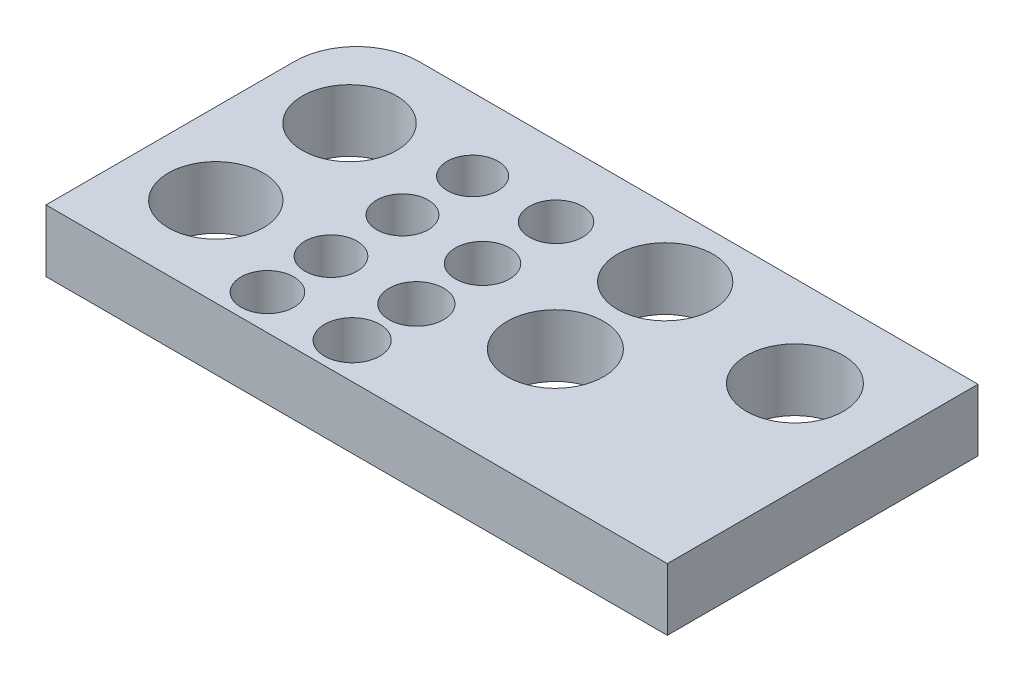
ISO-10303-21;
HEADER;
FILE_DESCRIPTION(('STEP AP214'),'2;1');
FILE_NAME('part.step','',(''),(''),'','','');
FILE_SCHEMA(('AUTOMOTIVE_DESIGN { 1 0 10303 214 1 1 1 1 }'));
ENDSEC;
DATA;
#1=APPLICATION_CONTEXT('core data for automotive mechanical design processes');
#2=APPLICATION_PROTOCOL_DEFINITION('international standard','automotive_design',2000,#1);
#3=PRODUCT_CONTEXT('',#1,'mechanical');
#4=PRODUCT('Part','Part','',(#3));
#5=PRODUCT_RELATED_PRODUCT_CATEGORY('part','',(#4));
#6=PRODUCT_DEFINITION_FORMATION('','',#4);
#7=PRODUCT_DEFINITION_CONTEXT('part definition',#1,'design');
#8=PRODUCT_DEFINITION('design','',#6,#7);
#9=PRODUCT_DEFINITION_SHAPE('','',#8);
#10=(LENGTH_UNIT() NAMED_UNIT(*) SI_UNIT(.MILLI.,.METRE.));
#11=(NAMED_UNIT(*) PLANE_ANGLE_UNIT() SI_UNIT($,.RADIAN.));
#12=(NAMED_UNIT(*) SI_UNIT($,.STERADIAN.) SOLID_ANGLE_UNIT());
#13=UNCERTAINTY_MEASURE_WITH_UNIT(LENGTH_MEASURE(1.E-05),#10,'distance_accuracy_value','');
#14=(GEOMETRIC_REPRESENTATION_CONTEXT(3) GLOBAL_UNCERTAINTY_ASSIGNED_CONTEXT((#13)) GLOBAL_UNIT_ASSIGNED_CONTEXT((#10,
#11,#12)) REPRESENTATION_CONTEXT('',''));
#15=CARTESIAN_POINT('',(0.,0.,0.));
#16=DIRECTION('',(0.,0.,1.));
#17=DIRECTION('',(1.,0.,0.));
#18=AXIS2_PLACEMENT_3D('',#15,#16,#17);
#19=CARTESIAN_POINT('',(50.,10.,25.));
#20=DIRECTION('',(-1.,0.,0.));
#21=DIRECTION('',(0.,0.,1.));
#22=AXIS2_PLACEMENT_3D('',#19,#20,#21);
#23=PLANE('',#22);
#24=DIRECTION('',(0.,0.,-1.));
#25=VECTOR('',#24,1.);
#26=CARTESIAN_POINT('',(50.,0.,25.));
#27=LINE('',#26,#25);
#28=CARTESIAN_POINT('',(50.,0.,25.));
#29=VERTEX_POINT('',#28);
#30=CARTESIAN_POINT('',(50.,0.,-25.));
#31=VERTEX_POINT('',#30);
#32=EDGE_CURVE('E106',#29,#31,#27,.T.);
#33=ORIENTED_EDGE('',*,*,#32,.T.);
#34=DIRECTION('',(0.,-1.,0.));
#35=VECTOR('',#34,1.);
#36=CARTESIAN_POINT('',(50.,10.,-25.));
#37=LINE('',#36,#35);
#38=CARTESIAN_POINT('',(50.,10.,-25.));
#39=VERTEX_POINT('',#38);
#40=EDGE_CURVE('E87',#39,#31,#37,.T.);
#41=ORIENTED_EDGE('',*,*,#40,.F.);
#42=DIRECTION('',(0.,0.,-1.));
#43=VECTOR('',#42,1.);
#44=CARTESIAN_POINT('',(50.,10.,25.));
#45=LINE('',#44,#43);
#46=CARTESIAN_POINT('',(50.,10.,25.));
#47=VERTEX_POINT('',#46);
#48=EDGE_CURVE('E93',#47,#39,#45,.T.);
#49=ORIENTED_EDGE('',*,*,#48,.F.);
#50=DIRECTION('',(0.,-1.,0.));
#51=VECTOR('',#50,1.);
#52=CARTESIAN_POINT('',(50.,10.,25.));
#53=LINE('',#52,#51);
#54=EDGE_CURVE('E116',#47,#29,#53,.T.);
#55=ORIENTED_EDGE('',*,*,#54,.T.);
#56=EDGE_LOOP('',(#33,#41,#49,#55));
#57=FACE_BOUND('',#56,.T.);
#58=ADVANCED_FACE('F39',(#57),#23,.F.);
#59=CARTESIAN_POINT('',(-50.,10.,-25.));
#60=DIRECTION('',(0.,0.,1.));
#61=DIRECTION('',(1.,0.,0.));
#62=AXIS2_PLACEMENT_3D('',#59,#60,#61);
#63=PLANE('',#62);
#64=DIRECTION('',(-1.,0.,0.));
#65=VECTOR('',#64,1.);
#66=CARTESIAN_POINT('',(-50.,0.,-25.));
#67=LINE('',#66,#65);
#68=CARTESIAN_POINT('',(-40.,0.,-25.));
#69=VERTEX_POINT('',#68);
#70=EDGE_CURVE('E129',#31,#69,#67,.T.);
#71=ORIENTED_EDGE('',*,*,#70,.T.);
#72=DIRECTION('',(0.,-1.,0.));
#73=VECTOR('',#72,1.);
#74=CARTESIAN_POINT('',(-40.,10.,-25.));
#75=LINE('',#74,#73);
#76=CARTESIAN_POINT('',(-40.,10.,-25.));
#77=VERTEX_POINT('',#76);
#78=EDGE_CURVE('E48',#69,#77,#75,.F.);
#79=ORIENTED_EDGE('',*,*,#78,.T.);
#80=DIRECTION('',(-1.,0.,0.));
#81=VECTOR('',#80,1.);
#82=CARTESIAN_POINT('',(-50.,10.,-25.));
#83=LINE('',#82,#81);
#84=EDGE_CURVE('E83',#39,#77,#83,.T.);
#85=ORIENTED_EDGE('',*,*,#84,.F.);
#86=ORIENTED_EDGE('',*,*,#40,.T.);
#87=EDGE_LOOP('',(#71,#79,#85,#86));
#88=FACE_BOUND('',#87,.T.);
#89=ADVANCED_FACE('F85',(#88),#63,.F.);
#90=CARTESIAN_POINT('',(-50.,10.,25.));
#91=DIRECTION('',(1.,0.,0.));
#92=DIRECTION('',(0.,0.,-1.));
#93=AXIS2_PLACEMENT_3D('',#90,#91,#92);
#94=PLANE('',#93);
#95=DIRECTION('',(0.,0.,1.));
#96=VECTOR('',#95,1.);
#97=CARTESIAN_POINT('',(-50.,10.,25.));
#98=LINE('',#97,#96);
#99=CARTESIAN_POINT('',(-50.,10.,-15.));
#100=VERTEX_POINT('',#99);
#101=CARTESIAN_POINT('',(-50.,10.,25.));
#102=VERTEX_POINT('',#101);
#103=EDGE_CURVE('E92',#100,#102,#98,.T.);
#104=ORIENTED_EDGE('',*,*,#103,.F.);
#105=DIRECTION('',(0.,-1.,0.));
#106=VECTOR('',#105,1.);
#107=CARTESIAN_POINT('',(-50.,10.,-15.));
#108=LINE('',#107,#106);
#109=CARTESIAN_POINT('',(-50.,0.,-15.));
#110=VERTEX_POINT('',#109);
#111=EDGE_CURVE('E108',#100,#110,#108,.T.);
#112=ORIENTED_EDGE('',*,*,#111,.T.);
#113=DIRECTION('',(0.,0.,1.));
#114=VECTOR('',#113,1.);
#115=CARTESIAN_POINT('',(-50.,0.,25.));
#116=LINE('',#115,#114);
#117=CARTESIAN_POINT('',(-50.,0.,25.));
#118=VERTEX_POINT('',#117);
#119=EDGE_CURVE('E126',#110,#118,#116,.T.);
#120=ORIENTED_EDGE('',*,*,#119,.T.);
#121=DIRECTION('',(0.,-1.,0.));
#122=VECTOR('',#121,1.);
#123=CARTESIAN_POINT('',(-50.,10.,25.));
#124=LINE('',#123,#122);
#125=EDGE_CURVE('E109',#102,#118,#124,.T.);
#126=ORIENTED_EDGE('',*,*,#125,.F.);
#127=EDGE_LOOP('',(#104,#112,#120,#126));
#128=FACE_BOUND('',#127,.T.);
#129=ADVANCED_FACE('F292',(#128),#94,.F.);
#130=CARTESIAN_POINT('',(-50.,10.,25.));
#131=DIRECTION('',(0.,0.,-1.));
#132=DIRECTION('',(-1.,0.,0.));
#133=AXIS2_PLACEMENT_3D('',#130,#131,#132);
#134=PLANE('',#133);
#135=DIRECTION('',(1.,0.,0.));
#136=VECTOR('',#135,1.);
#137=CARTESIAN_POINT('',(-50.,0.,25.));
#138=LINE('',#137,#136);
#139=EDGE_CURVE('E103',#118,#29,#138,.T.);
#140=ORIENTED_EDGE('',*,*,#139,.T.);
#141=ORIENTED_EDGE('',*,*,#54,.F.);
#142=DIRECTION('',(1.,0.,0.));
#143=VECTOR('',#142,1.);
#144=CARTESIAN_POINT('',(-50.,10.,25.));
#145=LINE('',#144,#143);
#146=EDGE_CURVE('E98',#102,#47,#145,.T.);
#147=ORIENTED_EDGE('',*,*,#146,.F.);
#148=ORIENTED_EDGE('',*,*,#125,.T.);
#149=EDGE_LOOP('',(#140,#141,#147,#148));
#150=FACE_BOUND('',#149,.T.);
#151=ADVANCED_FACE('F248',(#150),#134,.F.);
#152=CARTESIAN_POINT('',(0.,10.,0.));
#153=DIRECTION('',(0.,-1.,0.));
#154=DIRECTION('',(0.,0.,-1.));
#155=AXIS2_PLACEMENT_3D('',#152,#153,#154);
#156=PLANE('',#155);
#157=CARTESIAN_POINT('',(35.1513154281321,10.,-10.3856159219481));
#158=DIRECTION('',(0.,1.,0.));
#159=DIRECTION('',(0.,0.,1.));
#160=AXIS2_PLACEMENT_3D('',#157,#158,#159);
#161=CIRCLE('',#160,7.8);
#162=CARTESIAN_POINT('',(35.1513154281321,10.,-2.58561592194814));
#163=VERTEX_POINT('',#162);
#164=EDGE_CURVE('E238',#163,#163,#161,.T.);
#165=ORIENTED_EDGE('',*,*,#164,.F.);
#166=EDGE_LOOP('',(#165));
#167=FACE_BOUND('',#166,.T.);
#168=CARTESIAN_POINT('',(11.0779903167447,10.,4.1009867999487));
#169=DIRECTION('',(0.,1.,0.));
#170=DIRECTION('',(0.,0.,1.));
#171=AXIS2_PLACEMENT_3D('',#168,#169,#170);
#172=CIRCLE('',#171,7.75);
#173=CARTESIAN_POINT('',(11.0779903167447,10.,11.8509867999487));
#174=VERTEX_POINT('',#173);
#175=EDGE_CURVE('E230',#174,#174,#172,.T.);
#176=ORIENTED_EDGE('',*,*,#175,.F.);
#177=EDGE_LOOP('',(#176));
#178=FACE_BOUND('',#177,.T.);
#179=CARTESIAN_POINT('',(10.5453946284396,10.,-14.1137857400834));
#180=DIRECTION('',(0.,1.,0.));
#181=DIRECTION('',(0.,0.,1.));
#182=AXIS2_PLACEMENT_3D('',#179,#180,#181);
#183=CIRCLE('',#182,7.7);
#184=CARTESIAN_POINT('',(10.5453946284396,10.,-6.41378574008336));
#185=VERTEX_POINT('',#184);
#186=EDGE_CURVE('E222',#185,#185,#183,.T.);
#187=ORIENTED_EDGE('',*,*,#186,.F.);
#188=EDGE_LOOP('',(#187));
#189=FACE_BOUND('',#188,.T.);
#190=CARTESIAN_POINT('',(-6.49766739732138,10.,19.2267043478116));
#191=DIRECTION('',(0.,1.,0.));
#192=DIRECTION('',(0.,0.,1.));
#193=AXIS2_PLACEMENT_3D('',#190,#191,#192);
#194=CIRCLE('',#193,4.45);
#195=CARTESIAN_POINT('',(-6.49766739732138,10.,23.6767043478116));
#196=VERTEX_POINT('',#195);
#197=EDGE_CURVE('E214',#196,#196,#194,.T.);
#198=ORIENTED_EDGE('',*,*,#197,.F.);
#199=EDGE_LOOP('',(#198));
#200=FACE_BOUND('',#199,.T.);
#201=CARTESIAN_POINT('',(-6.39114825966038,10.,9.00086713235498));
#202=DIRECTION('',(0.,1.,0.));
#203=DIRECTION('',(0.,0.,1.));
#204=AXIS2_PLACEMENT_3D('',#201,#202,#203);
#205=CIRCLE('',#204,4.4);
#206=CARTESIAN_POINT('',(-6.39114825966038,10.,13.400867132355));
#207=VERTEX_POINT('',#206);
#208=EDGE_CURVE('E206',#207,#207,#205,.T.);
#209=ORIENTED_EDGE('',*,*,#208,.F.);
#210=EDGE_LOOP('',(#209));
#211=FACE_BOUND('',#210,.T.);
#212=CARTESIAN_POINT('',(-6.71070567264338,10.,-1.97060404672865));
#213=DIRECTION('',(0.,1.,0.));
#214=DIRECTION('',(0.,0.,1.));
#215=AXIS2_PLACEMENT_3D('',#212,#213,#214);
#216=CIRCLE('',#215,4.35);
#217=CARTESIAN_POINT('',(-6.71070567264338,10.,2.37939595327135));
#218=VERTEX_POINT('',#217);
#219=EDGE_CURVE('E198',#218,#218,#216,.T.);
#220=ORIENTED_EDGE('',*,*,#219,.F.);
#221=EDGE_LOOP('',(#220));
#222=FACE_BOUND('',#221,.T.);
#223=CARTESIAN_POINT('',(-6.60418653498238,10.,-13.6877091894393));
#224=DIRECTION('',(0.,1.,0.));
#225=DIRECTION('',(0.,0.,1.));
#226=AXIS2_PLACEMENT_3D('',#223,#224,#225);
#227=CIRCLE('',#226,4.3);
#228=CARTESIAN_POINT('',(-6.60418653498238,10.,-9.38770918943933));
#229=VERTEX_POINT('',#228);
#230=EDGE_CURVE('E190',#229,#229,#227,.T.);
#231=ORIENTED_EDGE('',*,*,#230,.F.);
#232=EDGE_LOOP('',(#231));
#233=FACE_BOUND('',#232,.T.);
#234=CARTESIAN_POINT('',(-20.0255978802692,10.,19.3332234854726));
#235=DIRECTION('',(0.,1.,0.));
#236=DIRECTION('',(0.,0.,1.));
#237=AXIS2_PLACEMENT_3D('',#234,#235,#236);
#238=CIRCLE('',#237,4.25);
#239=CARTESIAN_POINT('',(-20.0255978802692,10.,23.5832234854726));
#240=VERTEX_POINT('',#239);
#241=EDGE_CURVE('E182',#240,#240,#238,.T.);
#242=ORIENTED_EDGE('',*,*,#241,.F.);
#243=EDGE_LOOP('',(#242));
#244=FACE_BOUND('',#243,.T.);
#245=CARTESIAN_POINT('',(-19.9190787426082,10.,9.213905407677));
#246=DIRECTION('',(0.,1.,0.));
#247=DIRECTION('',(0.,0.,1.));
#248=AXIS2_PLACEMENT_3D('',#245,#246,#247);
#249=CIRCLE('',#248,4.2);
#250=CARTESIAN_POINT('',(-19.9190787426082,10.,13.413905407677));
#251=VERTEX_POINT('',#250);
#252=EDGE_CURVE('E174',#251,#251,#249,.T.);
#253=ORIENTED_EDGE('',*,*,#252,.F.);
#254=EDGE_LOOP('',(#253));
#255=FACE_BOUND('',#254,.T.);
#256=CARTESIAN_POINT('',(-19.9190787426082,10.,-2.29016145971167));
#257=DIRECTION('',(0.,1.,0.));
#258=DIRECTION('',(0.,0.,1.));
#259=AXIS2_PLACEMENT_3D('',#256,#257,#258);
#260=CIRCLE('',#259,4.15);
#261=CARTESIAN_POINT('',(-19.9190787426082,10.,1.85983854028833));
#262=VERTEX_POINT('',#261);
#263=EDGE_CURVE('E166',#262,#262,#260,.T.);
#264=ORIENTED_EDGE('',*,*,#263,.F.);
#265=EDGE_LOOP('',(#264));
#266=FACE_BOUND('',#265,.T.);
#267=CARTESIAN_POINT('',(-19.7060404672861,10.,-13.3681517764563));
#268=DIRECTION('',(0.,1.,0.));
#269=DIRECTION('',(0.,0.,1.));
#270=AXIS2_PLACEMENT_3D('',#267,#268,#269);
#271=CIRCLE('',#270,4.1);
#272=CARTESIAN_POINT('',(-19.7060404672861,10.,-9.26815177645632));
#273=VERTEX_POINT('',#272);
#274=EDGE_CURVE('E158',#273,#273,#271,.T.);
#275=ORIENTED_EDGE('',*,*,#274,.F.);
#276=EDGE_LOOP('',(#275));
#277=FACE_BOUND('',#276,.T.);
#278=CARTESIAN_POINT('',(-36.9621407683692,10.,10.7051733349311));
#279=DIRECTION('',(0.,1.,0.));
#280=DIRECTION('',(0.,0.,1.));
#281=AXIS2_PLACEMENT_3D('',#278,#279,#280);
#282=CIRCLE('',#281,7.65);
#283=CARTESIAN_POINT('',(-36.9621407683692,10.,18.3551733349311));
#284=VERTEX_POINT('',#283);
#285=EDGE_CURVE('E150',#284,#284,#282,.T.);
#286=ORIENTED_EDGE('',*,*,#285,.F.);
#287=EDGE_LOOP('',(#286));
#288=FACE_BOUND('',#287,.T.);
#289=CARTESIAN_POINT('',(-36.9621407683692,10.,-10.8116924725922));
#290=DIRECTION('',(0.,1.,0.));
#291=DIRECTION('',(0.,0.,1.));
#292=AXIS2_PLACEMENT_3D('',#289,#290,#291);
#293=CIRCLE('',#292,7.59999999999999);
#294=CARTESIAN_POINT('',(-36.9621407683692,10.,-3.21169247259218));
#295=VERTEX_POINT('',#294);
#296=EDGE_CURVE('E142',#295,#295,#293,.T.);
#297=ORIENTED_EDGE('',*,*,#296,.F.);
#298=EDGE_LOOP('',(#297));
#299=FACE_BOUND('',#298,.T.);
#300=ORIENTED_EDGE('',*,*,#84,.T.);
#301=CARTESIAN_POINT('',(-40.,10.,-15.));
#302=DIRECTION('',(0.,-1.,0.));
#303=DIRECTION('',(0.,0.,-1.));
#304=AXIS2_PLACEMENT_3D('',#301,#302,#303);
#305=CIRCLE('',#304,10.);
#306=EDGE_CURVE('E11',#77,#100,#305,.F.);
#307=ORIENTED_EDGE('',*,*,#306,.T.);
#308=ORIENTED_EDGE('',*,*,#103,.T.);
#309=ORIENTED_EDGE('',*,*,#146,.T.);
#310=ORIENTED_EDGE('',*,*,#48,.T.);
#311=EDGE_LOOP('',(#300,#307,#308,#309,#310));
#312=FACE_BOUND('',#311,.T.);
#313=ADVANCED_FACE('F96',(#167,#178,#189,#200,#211,#222,#233,#244,#255,#266,#277,#288,#299,
#312),#156,.F.);
#314=CARTESIAN_POINT('',(0.,0.,0.));
#315=DIRECTION('',(0.,-1.,0.));
#316=DIRECTION('',(0.,0.,-1.));
#317=AXIS2_PLACEMENT_3D('',#314,#315,#316);
#318=PLANE('',#317);
#319=CARTESIAN_POINT('',(35.1513154281321,0.,-10.3856159219481));
#320=DIRECTION('',(0.,1.,0.));
#321=DIRECTION('',(0.,0.,1.));
#322=AXIS2_PLACEMENT_3D('',#319,#320,#321);
#323=CIRCLE('',#322,7.8);
#324=CARTESIAN_POINT('',(35.1513154281321,0.,-2.58561592194814));
#325=VERTEX_POINT('',#324);
#326=EDGE_CURVE('E234',#325,#325,#323,.T.);
#327=ORIENTED_EDGE('',*,*,#326,.T.);
#328=EDGE_LOOP('',(#327));
#329=FACE_BOUND('',#328,.T.);
#330=CARTESIAN_POINT('',(11.0779903167447,0.,4.1009867999487));
#331=DIRECTION('',(0.,1.,0.));
#332=DIRECTION('',(0.,0.,1.));
#333=AXIS2_PLACEMENT_3D('',#330,#331,#332);
#334=CIRCLE('',#333,7.75);
#335=CARTESIAN_POINT('',(11.0779903167447,0.,11.8509867999487));
#336=VERTEX_POINT('',#335);
#337=EDGE_CURVE('E226',#336,#336,#334,.T.);
#338=ORIENTED_EDGE('',*,*,#337,.T.);
#339=EDGE_LOOP('',(#338));
#340=FACE_BOUND('',#339,.T.);
#341=CARTESIAN_POINT('',(10.5453946284396,0.,-14.1137857400834));
#342=DIRECTION('',(0.,1.,0.));
#343=DIRECTION('',(0.,0.,1.));
#344=AXIS2_PLACEMENT_3D('',#341,#342,#343);
#345=CIRCLE('',#344,7.7);
#346=CARTESIAN_POINT('',(10.5453946284396,0.,-6.41378574008336));
#347=VERTEX_POINT('',#346);
#348=EDGE_CURVE('E218',#347,#347,#345,.T.);
#349=ORIENTED_EDGE('',*,*,#348,.T.);
#350=EDGE_LOOP('',(#349));
#351=FACE_BOUND('',#350,.T.);
#352=CARTESIAN_POINT('',(-6.49766739732138,0.,19.2267043478116));
#353=DIRECTION('',(0.,1.,0.));
#354=DIRECTION('',(0.,0.,1.));
#355=AXIS2_PLACEMENT_3D('',#352,#353,#354);
#356=CIRCLE('',#355,4.45);
#357=CARTESIAN_POINT('',(-6.49766739732138,0.,23.6767043478116));
#358=VERTEX_POINT('',#357);
#359=EDGE_CURVE('E210',#358,#358,#356,.T.);
#360=ORIENTED_EDGE('',*,*,#359,.T.);
#361=EDGE_LOOP('',(#360));
#362=FACE_BOUND('',#361,.T.);
#363=CARTESIAN_POINT('',(-6.39114825966038,0.,9.00086713235498));
#364=DIRECTION('',(0.,1.,0.));
#365=DIRECTION('',(0.,0.,1.));
#366=AXIS2_PLACEMENT_3D('',#363,#364,#365);
#367=CIRCLE('',#366,4.4);
#368=CARTESIAN_POINT('',(-6.39114825966038,0.,13.400867132355));
#369=VERTEX_POINT('',#368);
#370=EDGE_CURVE('E202',#369,#369,#367,.T.);
#371=ORIENTED_EDGE('',*,*,#370,.T.);
#372=EDGE_LOOP('',(#371));
#373=FACE_BOUND('',#372,.T.);
#374=CARTESIAN_POINT('',(-6.71070567264338,0.,-1.97060404672865));
#375=DIRECTION('',(0.,1.,0.));
#376=DIRECTION('',(0.,0.,1.));
#377=AXIS2_PLACEMENT_3D('',#374,#375,#376);
#378=CIRCLE('',#377,4.35);
#379=CARTESIAN_POINT('',(-6.71070567264338,0.,2.37939595327135));
#380=VERTEX_POINT('',#379);
#381=EDGE_CURVE('E194',#380,#380,#378,.T.);
#382=ORIENTED_EDGE('',*,*,#381,.T.);
#383=EDGE_LOOP('',(#382));
#384=FACE_BOUND('',#383,.T.);
#385=CARTESIAN_POINT('',(-6.60418653498238,0.,-13.6877091894393));
#386=DIRECTION('',(0.,1.,0.));
#387=DIRECTION('',(0.,0.,1.));
#388=AXIS2_PLACEMENT_3D('',#385,#386,#387);
#389=CIRCLE('',#388,4.3);
#390=CARTESIAN_POINT('',(-6.60418653498238,0.,-9.38770918943933));
#391=VERTEX_POINT('',#390);
#392=EDGE_CURVE('E186',#391,#391,#389,.T.);
#393=ORIENTED_EDGE('',*,*,#392,.T.);
#394=EDGE_LOOP('',(#393));
#395=FACE_BOUND('',#394,.T.);
#396=CARTESIAN_POINT('',(-20.0255978802692,0.,19.3332234854726));
#397=DIRECTION('',(0.,1.,0.));
#398=DIRECTION('',(0.,0.,1.));
#399=AXIS2_PLACEMENT_3D('',#396,#397,#398);
#400=CIRCLE('',#399,4.25);
#401=CARTESIAN_POINT('',(-20.0255978802692,0.,23.5832234854726));
#402=VERTEX_POINT('',#401);
#403=EDGE_CURVE('E178',#402,#402,#400,.T.);
#404=ORIENTED_EDGE('',*,*,#403,.T.);
#405=EDGE_LOOP('',(#404));
#406=FACE_BOUND('',#405,.T.);
#407=CARTESIAN_POINT('',(-19.9190787426082,0.,9.213905407677));
#408=DIRECTION('',(0.,1.,0.));
#409=DIRECTION('',(0.,0.,1.));
#410=AXIS2_PLACEMENT_3D('',#407,#408,#409);
#411=CIRCLE('',#410,4.2);
#412=CARTESIAN_POINT('',(-19.9190787426082,0.,13.413905407677));
#413=VERTEX_POINT('',#412);
#414=EDGE_CURVE('E170',#413,#413,#411,.T.);
#415=ORIENTED_EDGE('',*,*,#414,.T.);
#416=EDGE_LOOP('',(#415));
#417=FACE_BOUND('',#416,.T.);
#418=CARTESIAN_POINT('',(-19.9190787426082,0.,-2.29016145971167));
#419=DIRECTION('',(0.,1.,0.));
#420=DIRECTION('',(0.,0.,1.));
#421=AXIS2_PLACEMENT_3D('',#418,#419,#420);
#422=CIRCLE('',#421,4.15);
#423=CARTESIAN_POINT('',(-19.9190787426082,0.,1.85983854028833));
#424=VERTEX_POINT('',#423);
#425=EDGE_CURVE('E162',#424,#424,#422,.T.);
#426=ORIENTED_EDGE('',*,*,#425,.T.);
#427=EDGE_LOOP('',(#426));
#428=FACE_BOUND('',#427,.T.);
#429=CARTESIAN_POINT('',(-19.7060404672861,0.,-13.3681517764563));
#430=DIRECTION('',(0.,1.,0.));
#431=DIRECTION('',(0.,0.,1.));
#432=AXIS2_PLACEMENT_3D('',#429,#430,#431);
#433=CIRCLE('',#432,4.1);
#434=CARTESIAN_POINT('',(-19.7060404672861,0.,-9.26815177645632));
#435=VERTEX_POINT('',#434);
#436=EDGE_CURVE('E154',#435,#435,#433,.T.);
#437=ORIENTED_EDGE('',*,*,#436,.T.);
#438=EDGE_LOOP('',(#437));
#439=FACE_BOUND('',#438,.T.);
#440=CARTESIAN_POINT('',(-36.9621407683692,0.,10.7051733349311));
#441=DIRECTION('',(0.,1.,0.));
#442=DIRECTION('',(0.,0.,1.));
#443=AXIS2_PLACEMENT_3D('',#440,#441,#442);
#444=CIRCLE('',#443,7.65);
#445=CARTESIAN_POINT('',(-36.9621407683692,0.,18.3551733349311));
#446=VERTEX_POINT('',#445);
#447=EDGE_CURVE('E146',#446,#446,#444,.T.);
#448=ORIENTED_EDGE('',*,*,#447,.T.);
#449=EDGE_LOOP('',(#448));
#450=FACE_BOUND('',#449,.T.);
#451=CARTESIAN_POINT('',(-36.9621407683692,0.,-10.8116924725922));
#452=DIRECTION('',(0.,1.,0.));
#453=DIRECTION('',(0.,0.,1.));
#454=AXIS2_PLACEMENT_3D('',#451,#452,#453);
#455=CIRCLE('',#454,7.59999999999999);
#456=CARTESIAN_POINT('',(-36.9621407683692,0.,-3.21169247259218));
#457=VERTEX_POINT('',#456);
#458=EDGE_CURVE('E134',#457,#457,#455,.T.);
#459=ORIENTED_EDGE('',*,*,#458,.T.);
#460=EDGE_LOOP('',(#459));
#461=FACE_BOUND('',#460,.T.);
#462=ORIENTED_EDGE('',*,*,#119,.F.);
#463=CARTESIAN_POINT('',(-40.,0.,-15.));
#464=DIRECTION('',(0.,-1.,0.));
#465=DIRECTION('',(0.,0.,-1.));
#466=AXIS2_PLACEMENT_3D('',#463,#464,#465);
#467=CIRCLE('',#466,10.);
#468=EDGE_CURVE('E62',#110,#69,#467,.T.);
#469=ORIENTED_EDGE('',*,*,#468,.T.);
#470=ORIENTED_EDGE('',*,*,#70,.F.);
#471=ORIENTED_EDGE('',*,*,#32,.F.);
#472=ORIENTED_EDGE('',*,*,#139,.F.);
#473=EDGE_LOOP('',(#462,#469,#470,#471,#472));
#474=FACE_BOUND('',#473,.T.);
#475=ADVANCED_FACE('F247',(#329,#340,#351,#362,#373,#384,#395,#406,#417,#428,#439,#450,#461,
#474),#318,.T.);
#476=CARTESIAN_POINT('',(-40.,10.,-15.));
#477=DIRECTION('',(0.,-1.,0.));
#478=DIRECTION('',(0.,0.,-1.));
#479=AXIS2_PLACEMENT_3D('',#476,#477,#478);
#480=CYLINDRICAL_SURFACE('',#479,10.);
#481=ORIENTED_EDGE('',*,*,#306,.F.);
#482=ORIENTED_EDGE('',*,*,#78,.F.);
#483=ORIENTED_EDGE('',*,*,#468,.F.);
#484=ORIENTED_EDGE('',*,*,#111,.F.);
#485=EDGE_LOOP('',(#481,#482,#483,#484));
#486=FACE_BOUND('',#485,.T.);
#487=ADVANCED_FACE('F41',(#486),#480,.T.);
#488=CARTESIAN_POINT('',(-36.9621407683692,10.,-10.8116924725922));
#489=DIRECTION('',(0.,1.,0.));
#490=DIRECTION('',(0.,0.,1.));
#491=AXIS2_PLACEMENT_3D('',#488,#489,#490);
#492=CYLINDRICAL_SURFACE('',#491,7.59999999999999);
#493=ORIENTED_EDGE('',*,*,#458,.F.);
#494=EDGE_LOOP('',(#493));
#495=FACE_BOUND('',#494,.T.);
#496=ORIENTED_EDGE('',*,*,#296,.T.);
#497=EDGE_LOOP('',(#496));
#498=FACE_BOUND('',#497,.T.);
#499=ADVANCED_FACE('F274',(#495,#498),#492,.F.);
#500=CARTESIAN_POINT('',(-36.9621407683692,10.,10.7051733349311));
#501=DIRECTION('',(0.,1.,0.));
#502=DIRECTION('',(0.,0.,1.));
#503=AXIS2_PLACEMENT_3D('',#500,#501,#502);
#504=CYLINDRICAL_SURFACE('',#503,7.65);
#505=ORIENTED_EDGE('',*,*,#447,.F.);
#506=EDGE_LOOP('',(#505));
#507=FACE_BOUND('',#506,.T.);
#508=ORIENTED_EDGE('',*,*,#285,.T.);
#509=EDGE_LOOP('',(#508));
#510=FACE_BOUND('',#509,.T.);
#511=ADVANCED_FACE('F276',(#507,#510),#504,.F.);
#512=CARTESIAN_POINT('',(-19.7060404672861,10.,-13.3681517764563));
#513=DIRECTION('',(0.,1.,0.));
#514=DIRECTION('',(0.,0.,1.));
#515=AXIS2_PLACEMENT_3D('',#512,#513,#514);
#516=CYLINDRICAL_SURFACE('',#515,4.1);
#517=ORIENTED_EDGE('',*,*,#436,.F.);
#518=EDGE_LOOP('',(#517));
#519=FACE_BOUND('',#518,.T.);
#520=ORIENTED_EDGE('',*,*,#274,.T.);
#521=EDGE_LOOP('',(#520));
#522=FACE_BOUND('',#521,.T.);
#523=ADVANCED_FACE('F283',(#519,#522),#516,.F.);
#524=CARTESIAN_POINT('',(-19.9190787426082,10.,-2.29016145971167));
#525=DIRECTION('',(0.,1.,0.));
#526=DIRECTION('',(0.,0.,1.));
#527=AXIS2_PLACEMENT_3D('',#524,#525,#526);
#528=CYLINDRICAL_SURFACE('',#527,4.15);
#529=ORIENTED_EDGE('',*,*,#425,.F.);
#530=EDGE_LOOP('',(#529));
#531=FACE_BOUND('',#530,.T.);
#532=ORIENTED_EDGE('',*,*,#263,.T.);
#533=EDGE_LOOP('',(#532));
#534=FACE_BOUND('',#533,.T.);
#535=ADVANCED_FACE('F337',(#531,#534),#528,.F.);
#536=CARTESIAN_POINT('',(-19.9190787426082,10.,9.213905407677));
#537=DIRECTION('',(0.,1.,0.));
#538=DIRECTION('',(0.,0.,1.));
#539=AXIS2_PLACEMENT_3D('',#536,#537,#538);
#540=CYLINDRICAL_SURFACE('',#539,4.2);
#541=ORIENTED_EDGE('',*,*,#414,.F.);
#542=EDGE_LOOP('',(#541));
#543=FACE_BOUND('',#542,.T.);
#544=ORIENTED_EDGE('',*,*,#252,.T.);
#545=EDGE_LOOP('',(#544));
#546=FACE_BOUND('',#545,.T.);
#547=ADVANCED_FACE('F342',(#543,#546),#540,.F.);
#548=CARTESIAN_POINT('',(-20.0255978802692,10.,19.3332234854726));
#549=DIRECTION('',(0.,1.,0.));
#550=DIRECTION('',(0.,0.,1.));
#551=AXIS2_PLACEMENT_3D('',#548,#549,#550);
#552=CYLINDRICAL_SURFACE('',#551,4.25);
#553=ORIENTED_EDGE('',*,*,#403,.F.);
#554=EDGE_LOOP('',(#553));
#555=FACE_BOUND('',#554,.T.);
#556=ORIENTED_EDGE('',*,*,#241,.T.);
#557=EDGE_LOOP('',(#556));
#558=FACE_BOUND('',#557,.T.);
#559=ADVANCED_FACE('F348',(#555,#558),#552,.F.);
#560=CARTESIAN_POINT('',(-6.60418653498238,10.,-13.6877091894393));
#561=DIRECTION('',(0.,1.,0.));
#562=DIRECTION('',(0.,0.,1.));
#563=AXIS2_PLACEMENT_3D('',#560,#561,#562);
#564=CYLINDRICAL_SURFACE('',#563,4.3);
#565=ORIENTED_EDGE('',*,*,#392,.F.);
#566=EDGE_LOOP('',(#565));
#567=FACE_BOUND('',#566,.T.);
#568=ORIENTED_EDGE('',*,*,#230,.T.);
#569=EDGE_LOOP('',(#568));
#570=FACE_BOUND('',#569,.T.);
#571=ADVANCED_FACE('F352',(#567,#570),#564,.F.);
#572=CARTESIAN_POINT('',(-6.71070567264338,10.,-1.97060404672865));
#573=DIRECTION('',(0.,1.,0.));
#574=DIRECTION('',(0.,0.,1.));
#575=AXIS2_PLACEMENT_3D('',#572,#573,#574);
#576=CYLINDRICAL_SURFACE('',#575,4.35);
#577=ORIENTED_EDGE('',*,*,#381,.F.);
#578=EDGE_LOOP('',(#577));
#579=FACE_BOUND('',#578,.T.);
#580=ORIENTED_EDGE('',*,*,#219,.T.);
#581=EDGE_LOOP('',(#580));
#582=FACE_BOUND('',#581,.T.);
#583=ADVANCED_FACE('F356',(#579,#582),#576,.F.);
#584=CARTESIAN_POINT('',(-6.39114825966038,10.,9.00086713235498));
#585=DIRECTION('',(0.,1.,0.));
#586=DIRECTION('',(0.,0.,1.));
#587=AXIS2_PLACEMENT_3D('',#584,#585,#586);
#588=CYLINDRICAL_SURFACE('',#587,4.4);
#589=ORIENTED_EDGE('',*,*,#370,.F.);
#590=EDGE_LOOP('',(#589));
#591=FACE_BOUND('',#590,.T.);
#592=ORIENTED_EDGE('',*,*,#208,.T.);
#593=EDGE_LOOP('',(#592));
#594=FACE_BOUND('',#593,.T.);
#595=ADVANCED_FACE('F360',(#591,#594),#588,.F.);
#596=CARTESIAN_POINT('',(-6.49766739732138,10.,19.2267043478116));
#597=DIRECTION('',(0.,1.,0.));
#598=DIRECTION('',(0.,0.,1.));
#599=AXIS2_PLACEMENT_3D('',#596,#597,#598);
#600=CYLINDRICAL_SURFACE('',#599,4.45);
#601=ORIENTED_EDGE('',*,*,#359,.F.);
#602=EDGE_LOOP('',(#601));
#603=FACE_BOUND('',#602,.T.);
#604=ORIENTED_EDGE('',*,*,#197,.T.);
#605=EDGE_LOOP('',(#604));
#606=FACE_BOUND('',#605,.T.);
#607=ADVANCED_FACE('F364',(#603,#606),#600,.F.);
#608=CARTESIAN_POINT('',(10.5453946284396,10.,-14.1137857400834));
#609=DIRECTION('',(0.,1.,0.));
#610=DIRECTION('',(0.,0.,1.));
#611=AXIS2_PLACEMENT_3D('',#608,#609,#610);
#612=CYLINDRICAL_SURFACE('',#611,7.7);
#613=ORIENTED_EDGE('',*,*,#348,.F.);
#614=EDGE_LOOP('',(#613));
#615=FACE_BOUND('',#614,.T.);
#616=ORIENTED_EDGE('',*,*,#186,.T.);
#617=EDGE_LOOP('',(#616));
#618=FACE_BOUND('',#617,.T.);
#619=ADVANCED_FACE('F368',(#615,#618),#612,.F.);
#620=CARTESIAN_POINT('',(11.0779903167447,10.,4.1009867999487));
#621=DIRECTION('',(0.,1.,0.));
#622=DIRECTION('',(0.,0.,1.));
#623=AXIS2_PLACEMENT_3D('',#620,#621,#622);
#624=CYLINDRICAL_SURFACE('',#623,7.75);
#625=ORIENTED_EDGE('',*,*,#337,.F.);
#626=EDGE_LOOP('',(#625));
#627=FACE_BOUND('',#626,.T.);
#628=ORIENTED_EDGE('',*,*,#175,.T.);
#629=EDGE_LOOP('',(#628));
#630=FACE_BOUND('',#629,.T.);
#631=ADVANCED_FACE('F372',(#627,#630),#624,.F.);
#632=CARTESIAN_POINT('',(35.1513154281321,10.,-10.3856159219481));
#633=DIRECTION('',(0.,1.,0.));
#634=DIRECTION('',(0.,0.,1.));
#635=AXIS2_PLACEMENT_3D('',#632,#633,#634);
#636=CYLINDRICAL_SURFACE('',#635,7.8);
#637=ORIENTED_EDGE('',*,*,#326,.F.);
#638=EDGE_LOOP('',(#637));
#639=FACE_BOUND('',#638,.T.);
#640=ORIENTED_EDGE('',*,*,#164,.T.);
#641=EDGE_LOOP('',(#640));
#642=FACE_BOUND('',#641,.T.);
#643=ADVANCED_FACE('F243',(#639,#642),#636,.F.);
#644=CLOSED_SHELL('',(#58,#89,#129,#151,#313,#475,#487,#499,#511,#523,#535,#547,#559,#571,#583,
#595,#607,#619,#631,#643));
#645=MANIFOLD_SOLID_BREP('B2',#644);
#646=ADVANCED_BREP_SHAPE_REPRESENTATION('',(#18,#645),#14);
#647=SHAPE_DEFINITION_REPRESENTATION(#9,#646);
ENDSEC;
END-ISO-10303-21;
